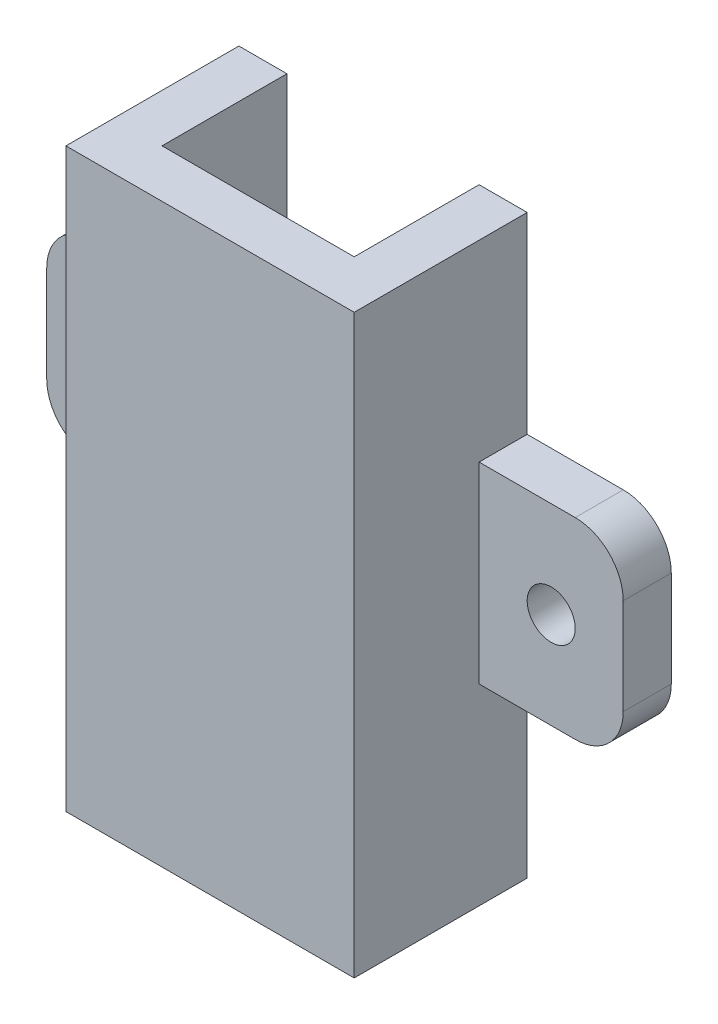
ISO-10303-21;
HEADER;
FILE_DESCRIPTION(('STEP AP214'),'2;1');
FILE_NAME('part.step','',(''),(''),'','','');
FILE_SCHEMA(('AUTOMOTIVE_DESIGN { 1 0 10303 214 1 1 1 1 }'));
ENDSEC;
DATA;
#1=APPLICATION_CONTEXT('core data for automotive mechanical design processes');
#2=APPLICATION_PROTOCOL_DEFINITION('international standard','automotive_design',2000,#1);
#3=PRODUCT_CONTEXT('',#1,'mechanical');
#4=PRODUCT('Part','Part','',(#3));
#5=PRODUCT_RELATED_PRODUCT_CATEGORY('part','',(#4));
#6=PRODUCT_DEFINITION_FORMATION('','',#4);
#7=PRODUCT_DEFINITION_CONTEXT('part definition',#1,'design');
#8=PRODUCT_DEFINITION('design','',#6,#7);
#9=PRODUCT_DEFINITION_SHAPE('','',#8);
#10=(LENGTH_UNIT() NAMED_UNIT(*) SI_UNIT(.MILLI.,.METRE.));
#11=(NAMED_UNIT(*) PLANE_ANGLE_UNIT() SI_UNIT($,.RADIAN.));
#12=(NAMED_UNIT(*) SI_UNIT($,.STERADIAN.) SOLID_ANGLE_UNIT());
#13=UNCERTAINTY_MEASURE_WITH_UNIT(LENGTH_MEASURE(1.E-05),#10,'distance_accuracy_value','');
#14=(GEOMETRIC_REPRESENTATION_CONTEXT(3) GLOBAL_UNCERTAINTY_ASSIGNED_CONTEXT((#13)) GLOBAL_UNIT_ASSIGNED_CONTEXT((#10,
#11,#12)) REPRESENTATION_CONTEXT('',''));
#15=CARTESIAN_POINT('',(0.,0.,0.));
#16=DIRECTION('',(0.,0.,1.));
#17=DIRECTION('',(1.,0.,0.));
#18=AXIS2_PLACEMENT_3D('',#15,#16,#17);
#19=CARTESIAN_POINT('',(38.1,76.2,0.));
#20=DIRECTION('',(-1.,0.,0.));
#21=DIRECTION('',(0.,0.,1.));
#22=AXIS2_PLACEMENT_3D('',#19,#20,#21);
#23=PLANE('',#22);
#24=DIRECTION('',(0.,0.,-1.));
#25=VECTOR('',#24,1.);
#26=CARTESIAN_POINT('',(38.1,25.4,-16.51));
#27=LINE('',#26,#25);
#28=CARTESIAN_POINT('',(38.1,25.4,-16.51));
#29=VERTEX_POINT('',#28);
#30=CARTESIAN_POINT('',(38.1,25.4,-22.86));
#31=VERTEX_POINT('',#30);
#32=EDGE_CURVE('E266',#29,#31,#27,.T.);
#33=ORIENTED_EDGE('',*,*,#32,.F.);
#34=DIRECTION('',(0.,1.,0.));
#35=VECTOR('',#34,1.);
#36=CARTESIAN_POINT('',(38.1,50.8,-16.51));
#37=LINE('',#36,#35);
#38=CARTESIAN_POINT('',(38.1,50.8,-16.51));
#39=VERTEX_POINT('',#38);
#40=EDGE_CURVE('E240',#29,#39,#37,.T.);
#41=ORIENTED_EDGE('',*,*,#40,.T.);
#42=DIRECTION('',(0.,0.,-1.));
#43=VECTOR('',#42,1.);
#44=CARTESIAN_POINT('',(38.1,50.8,-16.51));
#45=LINE('',#44,#43);
#46=CARTESIAN_POINT('',(38.1,50.8,-22.86));
#47=VERTEX_POINT('',#46);
#48=EDGE_CURVE('E256',#39,#47,#45,.T.);
#49=ORIENTED_EDGE('',*,*,#48,.T.);
#50=DIRECTION('',(0.,-1.,0.));
#51=VECTOR('',#50,1.);
#52=CARTESIAN_POINT('',(38.1,76.2,-22.86));
#53=LINE('',#52,#51);
#54=CARTESIAN_POINT('',(38.1,76.2,-22.86));
#55=VERTEX_POINT('',#54);
#56=EDGE_CURVE('E326',#55,#47,#53,.T.);
#57=ORIENTED_EDGE('',*,*,#56,.F.);
#58=DIRECTION('',(0.,0.,-1.));
#59=VECTOR('',#58,1.);
#60=CARTESIAN_POINT('',(38.1,76.2,0.));
#61=LINE('',#60,#59);
#62=CARTESIAN_POINT('',(38.1,76.2,0.));
#63=VERTEX_POINT('',#62);
#64=EDGE_CURVE('E298',#63,#55,#61,.T.);
#65=ORIENTED_EDGE('',*,*,#64,.F.);
#66=DIRECTION('',(0.,-1.,0.));
#67=VECTOR('',#66,1.);
#68=CARTESIAN_POINT('',(38.1,76.2,0.));
#69=LINE('',#68,#67);
#70=CARTESIAN_POINT('',(38.1,0.,0.));
#71=VERTEX_POINT('',#70);
#72=EDGE_CURVE('E330',#63,#71,#69,.T.);
#73=ORIENTED_EDGE('',*,*,#72,.T.);
#74=DIRECTION('',(0.,0.,-1.));
#75=VECTOR('',#74,1.);
#76=CARTESIAN_POINT('',(38.1,0.,0.));
#77=LINE('',#76,#75);
#78=CARTESIAN_POINT('',(38.1,0.,-22.86));
#79=VERTEX_POINT('',#78);
#80=EDGE_CURVE('E279',#71,#79,#77,.T.);
#81=ORIENTED_EDGE('',*,*,#80,.T.);
#82=EDGE_CURVE('E301',#31,#79,#53,.T.);
#83=ORIENTED_EDGE('',*,*,#82,.F.);
#84=EDGE_LOOP('',(#33,#41,#49,#57,#65,#73,#81,#83));
#85=FACE_BOUND('',#84,.T.);
#86=ADVANCED_FACE('F41',(#85),#23,.F.);
#87=CARTESIAN_POINT('',(0.,76.2,-22.86));
#88=DIRECTION('',(0.,0.,-1.));
#89=DIRECTION('',(-1.,0.,0.));
#90=AXIS2_PLACEMENT_3D('',#87,#88,#89);
#91=PLANE('',#90);
#92=DIRECTION('',(0.,-1.,0.));
#93=VECTOR('',#92,1.);
#94=CARTESIAN_POINT('',(57.15,50.8,-22.86));
#95=LINE('',#94,#93);
#96=CARTESIAN_POINT('',(57.15,44.45,-22.86));
#97=VERTEX_POINT('',#96);
#98=CARTESIAN_POINT('',(57.15,31.75,-22.86));
#99=VERTEX_POINT('',#98);
#100=EDGE_CURVE('E260',#97,#99,#95,.T.);
#101=ORIENTED_EDGE('',*,*,#100,.T.);
#102=CARTESIAN_POINT('',(50.8,31.75,-22.86));
#103=DIRECTION('',(0.,0.,-1.));
#104=DIRECTION('',(-1.,0.,0.));
#105=AXIS2_PLACEMENT_3D('',#102,#103,#104);
#106=CIRCLE('',#105,6.35);
#107=CARTESIAN_POINT('',(50.8,25.4,-22.86));
#108=VERTEX_POINT('',#107);
#109=EDGE_CURVE('E360',#99,#108,#106,.T.);
#110=ORIENTED_EDGE('',*,*,#109,.T.);
#111=DIRECTION('',(-1.,0.,0.));
#112=VECTOR('',#111,1.);
#113=CARTESIAN_POINT('',(38.1,25.4,-22.86));
#114=LINE('',#113,#112);
#115=EDGE_CURVE('E245',#108,#31,#114,.T.);
#116=ORIENTED_EDGE('',*,*,#115,.T.);
#117=ORIENTED_EDGE('',*,*,#82,.T.);
#118=DIRECTION('',(1.,0.,0.));
#119=VECTOR('',#118,1.);
#120=CARTESIAN_POINT('',(0.,0.,-22.86));
#121=LINE('',#120,#119);
#122=CARTESIAN_POINT('',(31.75,0.,-22.86));
#123=VERTEX_POINT('',#122);
#124=EDGE_CURVE('E270',#123,#79,#121,.T.);
#125=ORIENTED_EDGE('',*,*,#124,.F.);
#126=DIRECTION('',(0.,-1.,0.));
#127=VECTOR('',#126,1.);
#128=CARTESIAN_POINT('',(31.75,76.2,-22.86));
#129=LINE('',#128,#127);
#130=CARTESIAN_POINT('',(31.75,76.2,-22.86));
#131=VERTEX_POINT('',#130);
#132=EDGE_CURVE('E347',#131,#123,#129,.T.);
#133=ORIENTED_EDGE('',*,*,#132,.F.);
#134=DIRECTION('',(1.,0.,0.));
#135=VECTOR('',#134,1.);
#136=CARTESIAN_POINT('',(0.,76.2,-22.86));
#137=LINE('',#136,#135);
#138=EDGE_CURVE('E274',#131,#55,#137,.T.);
#139=ORIENTED_EDGE('',*,*,#138,.T.);
#140=ORIENTED_EDGE('',*,*,#56,.T.);
#141=DIRECTION('',(1.,0.,0.));
#142=VECTOR('',#141,1.);
#143=CARTESIAN_POINT('',(38.1,50.8,-22.86));
#144=LINE('',#143,#142);
#145=CARTESIAN_POINT('',(50.8,50.8,-22.86));
#146=VERTEX_POINT('',#145);
#147=EDGE_CURVE('E236',#47,#146,#144,.T.);
#148=ORIENTED_EDGE('',*,*,#147,.T.);
#149=CARTESIAN_POINT('',(50.8,44.45,-22.86));
#150=DIRECTION('',(0.,0.,-1.));
#151=DIRECTION('',(-1.,0.,0.));
#152=AXIS2_PLACEMENT_3D('',#149,#150,#151);
#153=CIRCLE('',#152,6.35);
#154=EDGE_CURVE('E357',#146,#97,#153,.T.);
#155=ORIENTED_EDGE('',*,*,#154,.T.);
#156=EDGE_LOOP('',(#101,#110,#116,#117,#125,#133,#139,#140,#148,#155));
#157=FACE_BOUND('',#156,.T.);
#158=CARTESIAN_POINT('',(47.625,38.1,-22.86));
#159=DIRECTION('',(0.,0.,-1.));
#160=DIRECTION('',(-1.,0.,0.));
#161=AXIS2_PLACEMENT_3D('',#158,#159,#160);
#162=CIRCLE('',#161,3.175);
#163=CARTESIAN_POINT('',(44.45,38.1,-22.86));
#164=VERTEX_POINT('',#163);
#165=EDGE_CURVE('E230',#164,#164,#162,.T.);
#166=ORIENTED_EDGE('',*,*,#165,.F.);
#167=EDGE_LOOP('',(#166));
#168=FACE_BOUND('',#167,.T.);
#169=ADVANCED_FACE('F420',(#157,#168),#91,.T.);
#170=CARTESIAN_POINT('',(31.75,76.2,0.));
#171=DIRECTION('',(1.,0.,0.));
#172=DIRECTION('',(0.,0.,-1.));
#173=AXIS2_PLACEMENT_3D('',#170,#171,#172);
#174=PLANE('',#173);
#175=DIRECTION('',(0.,0.,1.));
#176=VECTOR('',#175,1.);
#177=CARTESIAN_POINT('',(31.75,0.,0.));
#178=LINE('',#177,#176);
#179=CARTESIAN_POINT('',(31.75,0.,-6.35));
#180=VERTEX_POINT('',#179);
#181=EDGE_CURVE('E305',#123,#180,#178,.T.);
#182=ORIENTED_EDGE('',*,*,#181,.T.);
#183=DIRECTION('',(0.,-1.,0.));
#184=VECTOR('',#183,1.);
#185=CARTESIAN_POINT('',(31.75,76.2,-6.35));
#186=LINE('',#185,#184);
#187=CARTESIAN_POINT('',(31.75,76.2,-6.35));
#188=VERTEX_POINT('',#187);
#189=EDGE_CURVE('E344',#188,#180,#186,.T.);
#190=ORIENTED_EDGE('',*,*,#189,.F.);
#191=DIRECTION('',(0.,0.,1.));
#192=VECTOR('',#191,1.);
#193=CARTESIAN_POINT('',(31.75,76.2,0.));
#194=LINE('',#193,#192);
#195=EDGE_CURVE('E278',#131,#188,#194,.T.);
#196=ORIENTED_EDGE('',*,*,#195,.F.);
#197=ORIENTED_EDGE('',*,*,#132,.T.);
#198=EDGE_LOOP('',(#182,#190,#196,#197));
#199=FACE_BOUND('',#198,.T.);
#200=ADVANCED_FACE('F435',(#199),#174,.F.);
#201=CARTESIAN_POINT('',(0.,76.2,-6.35));
#202=DIRECTION('',(0.,0.,-1.));
#203=DIRECTION('',(-1.,0.,0.));
#204=AXIS2_PLACEMENT_3D('',#201,#202,#203);
#205=PLANE('',#204);
#206=ORIENTED_EDGE('',*,*,#189,.T.);
#207=DIRECTION('',(1.,0.,0.));
#208=VECTOR('',#207,1.);
#209=CARTESIAN_POINT('',(0.,0.,-6.35));
#210=LINE('',#209,#208);
#211=CARTESIAN_POINT('',(6.35,0.,-6.35));
#212=VERTEX_POINT('',#211);
#213=EDGE_CURVE('E309',#212,#180,#210,.T.);
#214=ORIENTED_EDGE('',*,*,#213,.F.);
#215=DIRECTION('',(0.,-1.,0.));
#216=VECTOR('',#215,1.);
#217=CARTESIAN_POINT('',(6.35,76.2,-6.35));
#218=LINE('',#217,#216);
#219=CARTESIAN_POINT('',(6.35,76.2,-6.35));
#220=VERTEX_POINT('',#219);
#221=EDGE_CURVE('E341',#220,#212,#218,.T.);
#222=ORIENTED_EDGE('',*,*,#221,.F.);
#223=DIRECTION('',(1.,0.,0.));
#224=VECTOR('',#223,1.);
#225=CARTESIAN_POINT('',(0.,76.2,-6.35));
#226=LINE('',#225,#224);
#227=EDGE_CURVE('E283',#220,#188,#226,.T.);
#228=ORIENTED_EDGE('',*,*,#227,.T.);
#229=EDGE_LOOP('',(#206,#214,#222,#228));
#230=FACE_BOUND('',#229,.T.);
#231=ADVANCED_FACE('F494',(#230),#205,.T.);
#232=CARTESIAN_POINT('',(6.35,76.2,0.));
#233=DIRECTION('',(1.,0.,0.));
#234=DIRECTION('',(0.,0.,-1.));
#235=AXIS2_PLACEMENT_3D('',#232,#233,#234);
#236=PLANE('',#235);
#237=DIRECTION('',(0.,0.,1.));
#238=VECTOR('',#237,1.);
#239=CARTESIAN_POINT('',(6.35,0.,0.));
#240=LINE('',#239,#238);
#241=CARTESIAN_POINT('',(6.35,0.,-22.86));
#242=VERTEX_POINT('',#241);
#243=EDGE_CURVE('E313',#242,#212,#240,.T.);
#244=ORIENTED_EDGE('',*,*,#243,.F.);
#245=DIRECTION('',(0.,-1.,0.));
#246=VECTOR('',#245,1.);
#247=CARTESIAN_POINT('',(6.35,76.2,-22.86));
#248=LINE('',#247,#246);
#249=CARTESIAN_POINT('',(6.35,76.2,-22.86));
#250=VERTEX_POINT('',#249);
#251=EDGE_CURVE('E338',#250,#242,#248,.T.);
#252=ORIENTED_EDGE('',*,*,#251,.F.);
#253=DIRECTION('',(0.,0.,1.));
#254=VECTOR('',#253,1.);
#255=CARTESIAN_POINT('',(6.35,76.2,0.));
#256=LINE('',#255,#254);
#257=EDGE_CURVE('E287',#250,#220,#256,.T.);
#258=ORIENTED_EDGE('',*,*,#257,.T.);
#259=ORIENTED_EDGE('',*,*,#221,.T.);
#260=EDGE_LOOP('',(#244,#252,#258,#259));
#261=FACE_BOUND('',#260,.T.);
#262=ADVANCED_FACE('F491',(#261),#236,.T.);
#263=DIRECTION('',(-1.,0.,0.));
#264=VECTOR('',#263,1.);
#265=CARTESIAN_POINT('',(0.,25.4,-22.86));
#266=LINE('',#265,#264);
#267=CARTESIAN_POINT('',(0.,25.4,-22.86));
#268=VERTEX_POINT('',#267);
#269=CARTESIAN_POINT('',(-12.7,25.4,-22.86));
#270=VERTEX_POINT('',#269);
#271=EDGE_CURVE('E184',#268,#270,#266,.T.);
#272=ORIENTED_EDGE('',*,*,#271,.T.);
#273=CARTESIAN_POINT('',(-12.7,31.75,-22.86));
#274=DIRECTION('',(0.,0.,-1.));
#275=DIRECTION('',(-1.,0.,0.));
#276=AXIS2_PLACEMENT_3D('',#273,#274,#275);
#277=CIRCLE('',#276,6.35);
#278=CARTESIAN_POINT('',(-19.05,31.75,-22.86));
#279=VERTEX_POINT('',#278);
#280=EDGE_CURVE('E381',#270,#279,#277,.T.);
#281=ORIENTED_EDGE('',*,*,#280,.T.);
#282=DIRECTION('',(0.,1.,0.));
#283=VECTOR('',#282,1.);
#284=CARTESIAN_POINT('',(-19.05,50.8,-22.86));
#285=LINE('',#284,#283);
#286=CARTESIAN_POINT('',(-19.05,44.45,-22.86));
#287=VERTEX_POINT('',#286);
#288=EDGE_CURVE('E212',#279,#287,#285,.T.);
#289=ORIENTED_EDGE('',*,*,#288,.T.);
#290=CARTESIAN_POINT('',(-12.7,44.45,-22.86));
#291=DIRECTION('',(0.,0.,-1.));
#292=DIRECTION('',(-1.,0.,0.));
#293=AXIS2_PLACEMENT_3D('',#290,#291,#292);
#294=CIRCLE('',#293,6.35);
#295=CARTESIAN_POINT('',(-12.7,50.8,-22.86));
#296=VERTEX_POINT('',#295);
#297=EDGE_CURVE('E378',#287,#296,#294,.T.);
#298=ORIENTED_EDGE('',*,*,#297,.T.);
#299=DIRECTION('',(1.,0.,0.));
#300=VECTOR('',#299,1.);
#301=CARTESIAN_POINT('',(0.,50.8,-22.86));
#302=LINE('',#301,#300);
#303=CARTESIAN_POINT('',(0.,50.8,-22.86));
#304=VERTEX_POINT('',#303);
#305=EDGE_CURVE('E218',#296,#304,#302,.T.);
#306=ORIENTED_EDGE('',*,*,#305,.T.);
#307=DIRECTION('',(0.,-1.,0.));
#308=VECTOR('',#307,1.);
#309=CARTESIAN_POINT('',(0.,76.2,-22.86));
#310=LINE('',#309,#308);
#311=CARTESIAN_POINT('',(0.,76.2,-22.86));
#312=VERTEX_POINT('',#311);
#313=EDGE_CURVE('E191',#312,#304,#310,.T.);
#314=ORIENTED_EDGE('',*,*,#313,.F.);
#315=EDGE_CURVE('E280',#312,#250,#137,.T.);
#316=ORIENTED_EDGE('',*,*,#315,.T.);
#317=ORIENTED_EDGE('',*,*,#251,.T.);
#318=CARTESIAN_POINT('',(0.,0.,-22.86));
#319=VERTEX_POINT('',#318);
#320=EDGE_CURVE('E186',#319,#242,#121,.T.);
#321=ORIENTED_EDGE('',*,*,#320,.F.);
#322=EDGE_CURVE('E179',#268,#319,#310,.T.);
#323=ORIENTED_EDGE('',*,*,#322,.F.);
#324=EDGE_LOOP('',(#272,#281,#289,#298,#306,#314,#316,#317,#321,#323));
#325=FACE_BOUND('',#324,.T.);
#326=CARTESIAN_POINT('',(-9.52500000000001,38.1,-22.86));
#327=DIRECTION('',(0.,0.,-1.));
#328=DIRECTION('',(1.,0.,0.));
#329=AXIS2_PLACEMENT_3D('',#326,#327,#328);
#330=CIRCLE('',#329,3.175);
#331=CARTESIAN_POINT('',(-6.35000000000001,38.1,-22.86));
#332=VERTEX_POINT('',#331);
#333=EDGE_CURVE('E221',#332,#332,#330,.T.);
#334=ORIENTED_EDGE('',*,*,#333,.F.);
#335=EDGE_LOOP('',(#334));
#336=FACE_BOUND('',#335,.T.);
#337=ADVANCED_FACE('F181',(#325,#336),#91,.T.);
#338=CARTESIAN_POINT('',(0.,76.2,0.));
#339=DIRECTION('',(-1.,0.,0.));
#340=DIRECTION('',(0.,0.,1.));
#341=AXIS2_PLACEMENT_3D('',#338,#339,#340);
#342=PLANE('',#341);
#343=DIRECTION('',(0.,0.,-1.));
#344=VECTOR('',#343,1.);
#345=CARTESIAN_POINT('',(0.,0.,0.));
#346=LINE('',#345,#344);
#347=CARTESIAN_POINT('',(0.,0.,0.));
#348=VERTEX_POINT('',#347);
#349=EDGE_CURVE('E317',#348,#319,#346,.T.);
#350=ORIENTED_EDGE('',*,*,#349,.F.);
#351=DIRECTION('',(0.,-1.,0.));
#352=VECTOR('',#351,1.);
#353=CARTESIAN_POINT('',(0.,76.2,0.));
#354=LINE('',#353,#352);
#355=CARTESIAN_POINT('',(0.,76.2,0.));
#356=VERTEX_POINT('',#355);
#357=EDGE_CURVE('E192',#356,#348,#354,.T.);
#358=ORIENTED_EDGE('',*,*,#357,.F.);
#359=DIRECTION('',(0.,0.,-1.));
#360=VECTOR('',#359,1.);
#361=CARTESIAN_POINT('',(0.,76.2,0.));
#362=LINE('',#361,#360);
#363=EDGE_CURVE('E291',#356,#312,#362,.T.);
#364=ORIENTED_EDGE('',*,*,#363,.T.);
#365=ORIENTED_EDGE('',*,*,#313,.T.);
#366=DIRECTION('',(0.,0.,-1.));
#367=VECTOR('',#366,1.);
#368=CARTESIAN_POINT('',(0.,50.8,-16.51));
#369=LINE('',#368,#367);
#370=CARTESIAN_POINT('',(0.,50.8,-16.51));
#371=VERTEX_POINT('',#370);
#372=EDGE_CURVE('E204',#371,#304,#369,.T.);
#373=ORIENTED_EDGE('',*,*,#372,.F.);
#374=DIRECTION('',(0.,-1.,0.));
#375=VECTOR('',#374,1.);
#376=CARTESIAN_POINT('',(0.,50.8,-16.51));
#377=LINE('',#376,#375);
#378=CARTESIAN_POINT('',(0.,25.4,-16.51));
#379=VERTEX_POINT('',#378);
#380=EDGE_CURVE('E199',#371,#379,#377,.T.);
#381=ORIENTED_EDGE('',*,*,#380,.T.);
#382=DIRECTION('',(0.,0.,-1.));
#383=VECTOR('',#382,1.);
#384=CARTESIAN_POINT('',(0.,25.4,-16.51));
#385=LINE('',#384,#383);
#386=EDGE_CURVE('E195',#379,#268,#385,.T.);
#387=ORIENTED_EDGE('',*,*,#386,.T.);
#388=ORIENTED_EDGE('',*,*,#322,.T.);
#389=EDGE_LOOP('',(#350,#358,#364,#365,#373,#381,#387,#388));
#390=FACE_BOUND('',#389,.T.);
#391=ADVANCED_FACE('F196',(#390),#342,.T.);
#392=CARTESIAN_POINT('',(0.,76.2,0.));
#393=DIRECTION('',(0.,0.,-1.));
#394=DIRECTION('',(-1.,0.,0.));
#395=AXIS2_PLACEMENT_3D('',#392,#393,#394);
#396=PLANE('',#395);
#397=ORIENTED_EDGE('',*,*,#357,.T.);
#398=DIRECTION('',(1.,0.,0.));
#399=VECTOR('',#398,1.);
#400=CARTESIAN_POINT('',(0.,0.,0.));
#401=LINE('',#400,#399);
#402=EDGE_CURVE('E320',#348,#71,#401,.T.);
#403=ORIENTED_EDGE('',*,*,#402,.T.);
#404=ORIENTED_EDGE('',*,*,#72,.F.);
#405=DIRECTION('',(1.,0.,0.));
#406=VECTOR('',#405,1.);
#407=CARTESIAN_POINT('',(0.,76.2,0.));
#408=LINE('',#407,#406);
#409=EDGE_CURVE('E295',#356,#63,#408,.T.);
#410=ORIENTED_EDGE('',*,*,#409,.F.);
#411=EDGE_LOOP('',(#397,#403,#404,#410));
#412=FACE_BOUND('',#411,.T.);
#413=ADVANCED_FACE('F484',(#412),#396,.F.);
#414=CARTESIAN_POINT('',(0.,76.2,0.));
#415=DIRECTION('',(0.,1.,0.));
#416=DIRECTION('',(0.,0.,1.));
#417=AXIS2_PLACEMENT_3D('',#414,#415,#416);
#418=PLANE('',#417);
#419=ORIENTED_EDGE('',*,*,#138,.F.);
#420=ORIENTED_EDGE('',*,*,#195,.T.);
#421=ORIENTED_EDGE('',*,*,#227,.F.);
#422=ORIENTED_EDGE('',*,*,#257,.F.);
#423=ORIENTED_EDGE('',*,*,#315,.F.);
#424=ORIENTED_EDGE('',*,*,#363,.F.);
#425=ORIENTED_EDGE('',*,*,#409,.T.);
#426=ORIENTED_EDGE('',*,*,#64,.T.);
#427=EDGE_LOOP('',(#419,#420,#421,#422,#423,#424,#425,#426));
#428=FACE_BOUND('',#427,.T.);
#429=ADVANCED_FACE('F440',(#428),#418,.T.);
#430=CARTESIAN_POINT('',(0.,0.,0.));
#431=DIRECTION('',(0.,1.,0.));
#432=DIRECTION('',(0.,0.,1.));
#433=AXIS2_PLACEMENT_3D('',#430,#431,#432);
#434=PLANE('',#433);
#435=ORIENTED_EDGE('',*,*,#124,.T.);
#436=ORIENTED_EDGE('',*,*,#80,.F.);
#437=ORIENTED_EDGE('',*,*,#402,.F.);
#438=ORIENTED_EDGE('',*,*,#349,.T.);
#439=ORIENTED_EDGE('',*,*,#320,.T.);
#440=ORIENTED_EDGE('',*,*,#243,.T.);
#441=ORIENTED_EDGE('',*,*,#213,.T.);
#442=ORIENTED_EDGE('',*,*,#181,.F.);
#443=EDGE_LOOP('',(#435,#436,#437,#438,#439,#440,#441,#442));
#444=FACE_BOUND('',#443,.T.);
#445=ADVANCED_FACE('F431',(#444),#434,.F.);
#446=CARTESIAN_POINT('',(38.1,25.4,-16.51));
#447=DIRECTION('',(0.,-1.,0.));
#448=DIRECTION('',(0.,0.,-1.));
#449=AXIS2_PLACEMENT_3D('',#446,#447,#448);
#450=PLANE('',#449);
#451=ORIENTED_EDGE('',*,*,#115,.F.);
#452=DIRECTION('',(0.,0.,-1.));
#453=VECTOR('',#452,1.);
#454=CARTESIAN_POINT('',(50.8,25.4,-16.51));
#455=LINE('',#454,#453);
#456=CARTESIAN_POINT('',(50.8,25.4,-16.51));
#457=VERTEX_POINT('',#456);
#458=EDGE_CURVE('E363',#108,#457,#455,.F.);
#459=ORIENTED_EDGE('',*,*,#458,.T.);
#460=DIRECTION('',(-1.,0.,0.));
#461=VECTOR('',#460,1.);
#462=CARTESIAN_POINT('',(38.1,25.4,-16.51));
#463=LINE('',#462,#461);
#464=EDGE_CURVE('E253',#457,#29,#463,.T.);
#465=ORIENTED_EDGE('',*,*,#464,.T.);
#466=ORIENTED_EDGE('',*,*,#32,.T.);
#467=EDGE_LOOP('',(#451,#459,#465,#466));
#468=FACE_BOUND('',#467,.T.);
#469=ADVANCED_FACE('F466',(#468),#450,.T.);
#470=CARTESIAN_POINT('',(57.15,50.8,-16.51));
#471=DIRECTION('',(1.,0.,0.));
#472=DIRECTION('',(0.,0.,-1.));
#473=AXIS2_PLACEMENT_3D('',#470,#471,#472);
#474=PLANE('',#473);
#475=DIRECTION('',(0.,-1.,0.));
#476=VECTOR('',#475,1.);
#477=CARTESIAN_POINT('',(57.15,50.8,-16.51));
#478=LINE('',#477,#476);
#479=CARTESIAN_POINT('',(57.15,44.45,-16.51));
#480=VERTEX_POINT('',#479);
#481=CARTESIAN_POINT('',(57.15,31.75,-16.51));
#482=VERTEX_POINT('',#481);
#483=EDGE_CURVE('E249',#480,#482,#478,.T.);
#484=ORIENTED_EDGE('',*,*,#483,.T.);
#485=DIRECTION('',(0.,0.,-1.));
#486=VECTOR('',#485,1.);
#487=CARTESIAN_POINT('',(57.15,31.75,-16.51));
#488=LINE('',#487,#486);
#489=EDGE_CURVE('E353',#482,#99,#488,.T.);
#490=ORIENTED_EDGE('',*,*,#489,.T.);
#491=ORIENTED_EDGE('',*,*,#100,.F.);
#492=DIRECTION('',(0.,0.,-1.));
#493=VECTOR('',#492,1.);
#494=CARTESIAN_POINT('',(57.15,44.45,-16.51));
#495=LINE('',#494,#493);
#496=EDGE_CURVE('E350',#97,#480,#495,.F.);
#497=ORIENTED_EDGE('',*,*,#496,.T.);
#498=EDGE_LOOP('',(#484,#490,#491,#497));
#499=FACE_BOUND('',#498,.T.);
#500=ADVANCED_FACE('F459',(#499),#474,.T.);
#501=CARTESIAN_POINT('',(38.1,50.8,-16.51));
#502=DIRECTION('',(0.,1.,0.));
#503=DIRECTION('',(0.,0.,1.));
#504=AXIS2_PLACEMENT_3D('',#501,#502,#503);
#505=PLANE('',#504);
#506=DIRECTION('',(1.,0.,0.));
#507=VECTOR('',#506,1.);
#508=CARTESIAN_POINT('',(38.1,50.8,-16.51));
#509=LINE('',#508,#507);
#510=CARTESIAN_POINT('',(50.8,50.8,-16.51));
#511=VERTEX_POINT('',#510);
#512=EDGE_CURVE('E244',#39,#511,#509,.T.);
#513=ORIENTED_EDGE('',*,*,#512,.T.);
#514=DIRECTION('',(0.,0.,-1.));
#515=VECTOR('',#514,1.);
#516=CARTESIAN_POINT('',(50.8,50.8,-16.51));
#517=LINE('',#516,#515);
#518=EDGE_CURVE('E372',#511,#146,#517,.T.);
#519=ORIENTED_EDGE('',*,*,#518,.T.);
#520=ORIENTED_EDGE('',*,*,#147,.F.);
#521=ORIENTED_EDGE('',*,*,#48,.F.);
#522=EDGE_LOOP('',(#513,#519,#520,#521));
#523=FACE_BOUND('',#522,.T.);
#524=ADVANCED_FACE('F447',(#523),#505,.T.);
#525=CARTESIAN_POINT('',(0.,0.,-16.51));
#526=DIRECTION('',(0.,0.,1.));
#527=DIRECTION('',(1.,0.,0.));
#528=AXIS2_PLACEMENT_3D('',#525,#526,#527);
#529=PLANE('',#528);
#530=CARTESIAN_POINT('',(47.625,38.1,-16.51));
#531=DIRECTION('',(0.,0.,-1.));
#532=DIRECTION('',(-1.,0.,0.));
#533=AXIS2_PLACEMENT_3D('',#530,#531,#532);
#534=CIRCLE('',#533,3.175);
#535=CARTESIAN_POINT('',(44.45,38.1,-16.51));
#536=VERTEX_POINT('',#535);
#537=EDGE_CURVE('E232',#536,#536,#534,.T.);
#538=ORIENTED_EDGE('',*,*,#537,.T.);
#539=EDGE_LOOP('',(#538));
#540=FACE_BOUND('',#539,.T.);
#541=ORIENTED_EDGE('',*,*,#464,.F.);
#542=CARTESIAN_POINT('',(50.8,31.75,-16.51));
#543=DIRECTION('',(0.,0.,1.));
#544=DIRECTION('',(1.,0.,0.));
#545=AXIS2_PLACEMENT_3D('',#542,#543,#544);
#546=CIRCLE('',#545,6.35);
#547=EDGE_CURVE('E369',#457,#482,#546,.T.);
#548=ORIENTED_EDGE('',*,*,#547,.T.);
#549=ORIENTED_EDGE('',*,*,#483,.F.);
#550=CARTESIAN_POINT('',(50.8,44.45,-16.51));
#551=DIRECTION('',(0.,0.,1.));
#552=DIRECTION('',(1.,0.,0.));
#553=AXIS2_PLACEMENT_3D('',#550,#551,#552);
#554=CIRCLE('',#553,6.35);
#555=EDGE_CURVE('E366',#480,#511,#554,.T.);
#556=ORIENTED_EDGE('',*,*,#555,.T.);
#557=ORIENTED_EDGE('',*,*,#512,.F.);
#558=ORIENTED_EDGE('',*,*,#40,.F.);
#559=EDGE_LOOP('',(#541,#548,#549,#556,#557,#558));
#560=FACE_BOUND('',#559,.T.);
#561=ADVANCED_FACE('F451',(#540,#560),#529,.T.);
#562=CARTESIAN_POINT('',(47.625,38.1,-16.51));
#563=DIRECTION('',(0.,0.,-1.));
#564=DIRECTION('',(-1.,0.,0.));
#565=AXIS2_PLACEMENT_3D('',#562,#563,#564);
#566=CYLINDRICAL_SURFACE('',#565,3.175);
#567=ORIENTED_EDGE('',*,*,#537,.F.);
#568=EDGE_LOOP('',(#567));
#569=FACE_BOUND('',#568,.T.);
#570=ORIENTED_EDGE('',*,*,#165,.T.);
#571=EDGE_LOOP('',(#570));
#572=FACE_BOUND('',#571,.T.);
#573=ADVANCED_FACE('F569',(#569,#572),#566,.F.);
#574=CARTESIAN_POINT('',(0.,50.8,-16.51));
#575=DIRECTION('',(0.,1.,0.));
#576=DIRECTION('',(0.,0.,1.));
#577=AXIS2_PLACEMENT_3D('',#574,#575,#576);
#578=PLANE('',#577);
#579=ORIENTED_EDGE('',*,*,#305,.F.);
#580=DIRECTION('',(0.,0.,-1.));
#581=VECTOR('',#580,1.);
#582=CARTESIAN_POINT('',(-12.7,50.8,-16.51));
#583=LINE('',#582,#581);
#584=CARTESIAN_POINT('',(-12.7,50.8,-16.51));
#585=VERTEX_POINT('',#584);
#586=EDGE_CURVE('E11',#296,#585,#583,.F.);
#587=ORIENTED_EDGE('',*,*,#586,.T.);
#588=DIRECTION('',(1.,0.,0.));
#589=VECTOR('',#588,1.);
#590=CARTESIAN_POINT('',(0.,50.8,-16.51));
#591=LINE('',#590,#589);
#592=EDGE_CURVE('E205',#585,#371,#591,.T.);
#593=ORIENTED_EDGE('',*,*,#592,.T.);
#594=ORIENTED_EDGE('',*,*,#372,.T.);
#595=EDGE_LOOP('',(#579,#587,#593,#594));
#596=FACE_BOUND('',#595,.T.);
#597=ADVANCED_FACE('F407',(#596),#578,.T.);
#598=CARTESIAN_POINT('',(-19.05,50.8,-16.51));
#599=DIRECTION('',(-1.,0.,0.));
#600=DIRECTION('',(0.,0.,1.));
#601=AXIS2_PLACEMENT_3D('',#598,#599,#600);
#602=PLANE('',#601);
#603=ORIENTED_EDGE('',*,*,#288,.F.);
#604=DIRECTION('',(0.,0.,-1.));
#605=VECTOR('',#604,1.);
#606=CARTESIAN_POINT('',(-19.05,31.75,-16.51));
#607=LINE('',#606,#605);
#608=CARTESIAN_POINT('',(-19.05,31.75,-16.51));
#609=VERTEX_POINT('',#608);
#610=EDGE_CURVE('E388',#279,#609,#607,.F.);
#611=ORIENTED_EDGE('',*,*,#610,.T.);
#612=DIRECTION('',(0.,1.,0.));
#613=VECTOR('',#612,1.);
#614=CARTESIAN_POINT('',(-19.05,50.8,-16.51));
#615=LINE('',#614,#613);
#616=CARTESIAN_POINT('',(-19.05,44.45,-16.51));
#617=VERTEX_POINT('',#616);
#618=EDGE_CURVE('E396',#609,#617,#615,.T.);
#619=ORIENTED_EDGE('',*,*,#618,.T.);
#620=DIRECTION('',(0.,0.,-1.));
#621=VECTOR('',#620,1.);
#622=CARTESIAN_POINT('',(-19.05,44.45,-16.51));
#623=LINE('',#622,#621);
#624=EDGE_CURVE('E384',#617,#287,#623,.T.);
#625=ORIENTED_EDGE('',*,*,#624,.T.);
#626=EDGE_LOOP('',(#603,#611,#619,#625));
#627=FACE_BOUND('',#626,.T.);
#628=ADVANCED_FACE('F404',(#627),#602,.T.);
#629=CARTESIAN_POINT('',(0.,25.4,-16.51));
#630=DIRECTION('',(0.,-1.,0.));
#631=DIRECTION('',(0.,0.,-1.));
#632=AXIS2_PLACEMENT_3D('',#629,#630,#631);
#633=PLANE('',#632);
#634=DIRECTION('',(-1.,0.,0.));
#635=VECTOR('',#634,1.);
#636=CARTESIAN_POINT('',(0.,25.4,-16.51));
#637=LINE('',#636,#635);
#638=CARTESIAN_POINT('',(-12.7,25.4,-16.51));
#639=VERTEX_POINT('',#638);
#640=EDGE_CURVE('E395',#379,#639,#637,.T.);
#641=ORIENTED_EDGE('',*,*,#640,.T.);
#642=DIRECTION('',(0.,0.,-1.));
#643=VECTOR('',#642,1.);
#644=CARTESIAN_POINT('',(-12.7,25.4,-16.51));
#645=LINE('',#644,#643);
#646=EDGE_CURVE('E210',#639,#270,#645,.T.);
#647=ORIENTED_EDGE('',*,*,#646,.T.);
#648=ORIENTED_EDGE('',*,*,#271,.F.);
#649=ORIENTED_EDGE('',*,*,#386,.F.);
#650=EDGE_LOOP('',(#641,#647,#648,#649));
#651=FACE_BOUND('',#650,.T.);
#652=ADVANCED_FACE('F208',(#651),#633,.T.);
#653=CARTESIAN_POINT('',(0.,0.,-16.51));
#654=DIRECTION('',(0.,0.,-1.));
#655=DIRECTION('',(-1.,0.,0.));
#656=AXIS2_PLACEMENT_3D('',#653,#654,#655);
#657=PLANE('',#656);
#658=CARTESIAN_POINT('',(-9.52500000000001,38.1,-16.51));
#659=DIRECTION('',(0.,0.,-1.));
#660=DIRECTION('',(1.,0.,0.));
#661=AXIS2_PLACEMENT_3D('',#658,#659,#660);
#662=CIRCLE('',#661,3.175);
#663=CARTESIAN_POINT('',(-6.35000000000001,38.1,-16.51));
#664=VERTEX_POINT('',#663);
#665=EDGE_CURVE('E213',#664,#664,#662,.T.);
#666=ORIENTED_EDGE('',*,*,#665,.T.);
#667=EDGE_LOOP('',(#666));
#668=FACE_BOUND('',#667,.T.);
#669=ORIENTED_EDGE('',*,*,#618,.F.);
#670=CARTESIAN_POINT('',(-12.7,31.75,-16.51));
#671=DIRECTION('',(0.,0.,-1.));
#672=DIRECTION('',(-1.,0.,0.));
#673=AXIS2_PLACEMENT_3D('',#670,#671,#672);
#674=CIRCLE('',#673,6.35);
#675=EDGE_CURVE('E50',#609,#639,#674,.F.);
#676=ORIENTED_EDGE('',*,*,#675,.T.);
#677=ORIENTED_EDGE('',*,*,#640,.F.);
#678=ORIENTED_EDGE('',*,*,#380,.F.);
#679=ORIENTED_EDGE('',*,*,#592,.F.);
#680=CARTESIAN_POINT('',(-12.7,44.45,-16.51));
#681=DIRECTION('',(0.,0.,-1.));
#682=DIRECTION('',(-1.,0.,0.));
#683=AXIS2_PLACEMENT_3D('',#680,#681,#682);
#684=CIRCLE('',#683,6.35);
#685=EDGE_CURVE('E62',#585,#617,#684,.F.);
#686=ORIENTED_EDGE('',*,*,#685,.T.);
#687=EDGE_LOOP('',(#669,#676,#677,#678,#679,#686));
#688=FACE_BOUND('',#687,.T.);
#689=ADVANCED_FACE('F394',(#668,#688),#657,.F.);
#690=CARTESIAN_POINT('',(-9.52500000000001,38.1,-16.51));
#691=DIRECTION('',(0.,0.,-1.));
#692=DIRECTION('',(-1.,0.,0.));
#693=AXIS2_PLACEMENT_3D('',#690,#691,#692);
#694=CYLINDRICAL_SURFACE('',#693,3.175);
#695=ORIENTED_EDGE('',*,*,#665,.F.);
#696=EDGE_LOOP('',(#695));
#697=FACE_BOUND('',#696,.T.);
#698=ORIENTED_EDGE('',*,*,#333,.T.);
#699=EDGE_LOOP('',(#698));
#700=FACE_BOUND('',#699,.T.);
#701=ADVANCED_FACE('F503',(#697,#700),#694,.F.);
#702=CARTESIAN_POINT('',(50.8,31.75,-16.51));
#703=DIRECTION('',(0.,0.,-1.));
#704=DIRECTION('',(-1.,0.,0.));
#705=AXIS2_PLACEMENT_3D('',#702,#703,#704);
#706=CYLINDRICAL_SURFACE('',#705,6.35);
#707=ORIENTED_EDGE('',*,*,#547,.F.);
#708=ORIENTED_EDGE('',*,*,#458,.F.);
#709=ORIENTED_EDGE('',*,*,#109,.F.);
#710=ORIENTED_EDGE('',*,*,#489,.F.);
#711=EDGE_LOOP('',(#707,#708,#709,#710));
#712=FACE_BOUND('',#711,.T.);
#713=ADVANCED_FACE('F463',(#712),#706,.T.);
#714=CARTESIAN_POINT('',(50.8,44.45,-16.51));
#715=DIRECTION('',(0.,0.,-1.));
#716=DIRECTION('',(-1.,0.,0.));
#717=AXIS2_PLACEMENT_3D('',#714,#715,#716);
#718=CYLINDRICAL_SURFACE('',#717,6.35);
#719=ORIENTED_EDGE('',*,*,#555,.F.);
#720=ORIENTED_EDGE('',*,*,#496,.F.);
#721=ORIENTED_EDGE('',*,*,#154,.F.);
#722=ORIENTED_EDGE('',*,*,#518,.F.);
#723=EDGE_LOOP('',(#719,#720,#721,#722));
#724=FACE_BOUND('',#723,.T.);
#725=ADVANCED_FACE('F456',(#724),#718,.T.);
#726=CARTESIAN_POINT('',(-12.7,31.75,-16.51));
#727=DIRECTION('',(0.,0.,-1.));
#728=DIRECTION('',(-1.,0.,0.));
#729=AXIS2_PLACEMENT_3D('',#726,#727,#728);
#730=CYLINDRICAL_SURFACE('',#729,6.35);
#731=ORIENTED_EDGE('',*,*,#675,.F.);
#732=ORIENTED_EDGE('',*,*,#610,.F.);
#733=ORIENTED_EDGE('',*,*,#280,.F.);
#734=ORIENTED_EDGE('',*,*,#646,.F.);
#735=EDGE_LOOP('',(#731,#732,#733,#734));
#736=FACE_BOUND('',#735,.T.);
#737=ADVANCED_FACE('F401',(#736),#730,.T.);
#738=CARTESIAN_POINT('',(-12.7,44.45,-16.51));
#739=DIRECTION('',(0.,0.,-1.));
#740=DIRECTION('',(-1.,0.,0.));
#741=AXIS2_PLACEMENT_3D('',#738,#739,#740);
#742=CYLINDRICAL_SURFACE('',#741,6.35);
#743=ORIENTED_EDGE('',*,*,#685,.F.);
#744=ORIENTED_EDGE('',*,*,#586,.F.);
#745=ORIENTED_EDGE('',*,*,#297,.F.);
#746=ORIENTED_EDGE('',*,*,#624,.F.);
#747=EDGE_LOOP('',(#743,#744,#745,#746));
#748=FACE_BOUND('',#747,.T.);
#749=ADVANCED_FACE('F43',(#748),#742,.T.);
#750=CLOSED_SHELL('',(#86,#169,#200,#231,#262,#337,#391,#413,#429,#445,#469,#500,#524,#561,#573,
#597,#628,#652,#689,#701,#713,#725,#737,#749));
#751=MANIFOLD_SOLID_BREP('B2',#750);
#752=ADVANCED_BREP_SHAPE_REPRESENTATION('',(#18,#751),#14);
#753=SHAPE_DEFINITION_REPRESENTATION(#9,#752);
ENDSEC;
END-ISO-10303-21;
